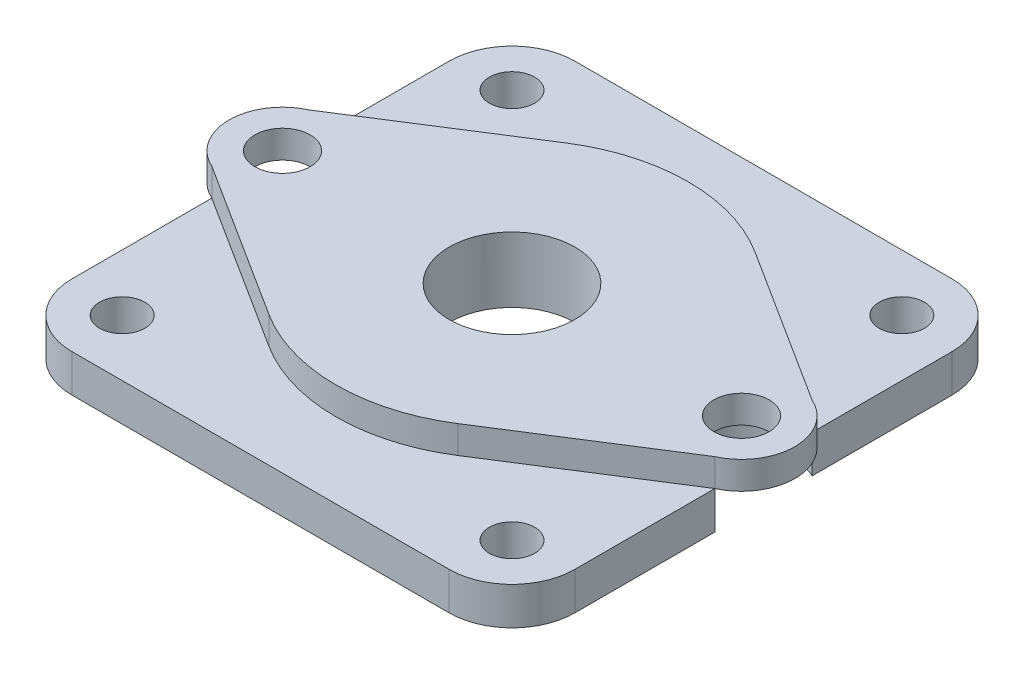
ISO-10303-21;
HEADER;
FILE_DESCRIPTION(('STEP AP214'),'2;1');
FILE_NAME('part.step','',(''),(''),'','','');
FILE_SCHEMA(('AUTOMOTIVE_DESIGN { 1 0 10303 214 1 1 1 1 }'));
ENDSEC;
DATA;
#1=APPLICATION_CONTEXT('core data for automotive mechanical design processes');
#2=APPLICATION_PROTOCOL_DEFINITION('international standard','automotive_design',2000,#1);
#3=PRODUCT_CONTEXT('',#1,'mechanical');
#4=PRODUCT('Part','Part','',(#3));
#5=PRODUCT_RELATED_PRODUCT_CATEGORY('part','',(#4));
#6=PRODUCT_DEFINITION_FORMATION('','',#4);
#7=PRODUCT_DEFINITION_CONTEXT('part definition',#1,'design');
#8=PRODUCT_DEFINITION('design','',#6,#7);
#9=PRODUCT_DEFINITION_SHAPE('','',#8);
#10=(LENGTH_UNIT() NAMED_UNIT(*) SI_UNIT(.MILLI.,.METRE.));
#11=(NAMED_UNIT(*) PLANE_ANGLE_UNIT() SI_UNIT($,.RADIAN.));
#12=(NAMED_UNIT(*) SI_UNIT($,.STERADIAN.) SOLID_ANGLE_UNIT());
#13=UNCERTAINTY_MEASURE_WITH_UNIT(LENGTH_MEASURE(1.E-05),#10,'distance_accuracy_value','');
#14=(GEOMETRIC_REPRESENTATION_CONTEXT(3) GLOBAL_UNCERTAINTY_ASSIGNED_CONTEXT((#13)) GLOBAL_UNIT_ASSIGNED_CONTEXT((#10,
#11,#12)) REPRESENTATION_CONTEXT('',''));
#15=CARTESIAN_POINT('',(0.,0.,0.));
#16=DIRECTION('',(0.,0.,1.));
#17=DIRECTION('',(1.,0.,0.));
#18=AXIS2_PLACEMENT_3D('',#15,#16,#17);
#19=CARTESIAN_POINT('',(-15.,3.,-15.));
#20=DIRECTION('',(0.,-1.,0.));
#21=DIRECTION('',(0.,0.,-1.));
#22=AXIS2_PLACEMENT_3D('',#19,#20,#21);
#23=PLANE('',#22);
#24=CARTESIAN_POINT('',(15.5,3.,15.5));
#25=DIRECTION('',(0.,1.,0.));
#26=DIRECTION('',(0.,0.,1.));
#27=AXIS2_PLACEMENT_3D('',#24,#25,#26);
#28=CIRCLE('',#27,1.79999999999999);
#29=CARTESIAN_POINT('',(15.5,3.,17.3));
#30=VERTEX_POINT('',#29);
#31=EDGE_CURVE('E272',#30,#30,#28,.T.);
#32=ORIENTED_EDGE('',*,*,#31,.F.);
#33=EDGE_LOOP('',(#32));
#34=FACE_BOUND('',#33,.T.);
#35=CARTESIAN_POINT('',(-15.5,3.,15.5));
#36=DIRECTION('',(0.,1.,0.));
#37=DIRECTION('',(0.,0.,1.));
#38=AXIS2_PLACEMENT_3D('',#35,#36,#37);
#39=CIRCLE('',#38,1.79999999999999);
#40=CARTESIAN_POINT('',(-15.5,3.,17.3));
#41=VERTEX_POINT('',#40);
#42=EDGE_CURVE('E278',#41,#41,#39,.T.);
#43=ORIENTED_EDGE('',*,*,#42,.F.);
#44=EDGE_LOOP('',(#43));
#45=FACE_BOUND('',#44,.T.);
#46=DIRECTION('',(0.843842743580431,0.,-0.536590555364751));
#47=VECTOR('',#46,1.);
#48=CARTESIAN_POINT('',(20.,3.,3.87298334620742));
#49=LINE('',#48,#47);
#50=CARTESIAN_POINT('',(7.51226777510651,3.,11.813798410126));
#51=VERTEX_POINT('',#50);
#52=CARTESIAN_POINT('',(20.,3.,3.87298334620742));
#53=VERTEX_POINT('',#52);
#54=EDGE_CURVE('E50',#51,#53,#49,.T.);
#55=ORIENTED_EDGE('',*,*,#54,.F.);
#56=CARTESIAN_POINT('',(0.,3.,0.));
#57=DIRECTION('',(0.,1.,0.));
#58=DIRECTION('',(0.,0.,1.));
#59=AXIS2_PLACEMENT_3D('',#56,#57,#58);
#60=CIRCLE('',#59,14.);
#61=CARTESIAN_POINT('',(-7.51226777510651,3.,11.813798410126));
#62=VERTEX_POINT('',#61);
#63=EDGE_CURVE('E54',#62,#51,#60,.T.);
#64=ORIENTED_EDGE('',*,*,#63,.F.);
#65=DIRECTION('',(0.843842743580431,0.,0.536590555364751));
#66=VECTOR('',#65,1.);
#67=CARTESIAN_POINT('',(-20.,3.,3.87298334620742));
#68=LINE('',#67,#66);
#69=CARTESIAN_POINT('',(-20.,3.,3.87298334620742));
#70=VERTEX_POINT('',#69);
#71=EDGE_CURVE('E162',#70,#62,#68,.T.);
#72=ORIENTED_EDGE('',*,*,#71,.F.);
#73=DIRECTION('',(0.,0.,1.));
#74=VECTOR('',#73,1.);
#75=CARTESIAN_POINT('',(-20.,3.,3.87298334620742));
#76=LINE('',#75,#74);
#77=CARTESIAN_POINT('',(-20.,3.,15.));
#78=VERTEX_POINT('',#77);
#79=EDGE_CURVE('E184',#70,#78,#76,.T.);
#80=ORIENTED_EDGE('',*,*,#79,.T.);
#81=CARTESIAN_POINT('',(-15.,3.,15.));
#82=DIRECTION('',(0.,1.,0.));
#83=DIRECTION('',(0.,0.,1.));
#84=AXIS2_PLACEMENT_3D('',#81,#82,#83);
#85=CIRCLE('',#84,5.);
#86=CARTESIAN_POINT('',(-15.,3.,20.));
#87=VERTEX_POINT('',#86);
#88=EDGE_CURVE('E196',#78,#87,#85,.T.);
#89=ORIENTED_EDGE('',*,*,#88,.T.);
#90=DIRECTION('',(1.,0.,0.));
#91=VECTOR('',#90,1.);
#92=CARTESIAN_POINT('',(-15.,3.,20.));
#93=LINE('',#92,#91);
#94=CARTESIAN_POINT('',(15.,3.,20.));
#95=VERTEX_POINT('',#94);
#96=EDGE_CURVE('E302',#87,#95,#93,.T.);
#97=ORIENTED_EDGE('',*,*,#96,.T.);
#98=CARTESIAN_POINT('',(15.,3.,15.));
#99=DIRECTION('',(0.,1.,0.));
#100=DIRECTION('',(0.,0.,1.));
#101=AXIS2_PLACEMENT_3D('',#98,#99,#100);
#102=CIRCLE('',#101,5.);
#103=CARTESIAN_POINT('',(20.,3.,15.));
#104=VERTEX_POINT('',#103);
#105=EDGE_CURVE('E304',#95,#104,#102,.T.);
#106=ORIENTED_EDGE('',*,*,#105,.T.);
#107=DIRECTION('',(0.,0.,-1.));
#108=VECTOR('',#107,1.);
#109=CARTESIAN_POINT('',(20.,3.,3.87298334620742));
#110=LINE('',#109,#108);
#111=EDGE_CURVE('E306',#104,#53,#110,.T.);
#112=ORIENTED_EDGE('',*,*,#111,.T.);
#113=EDGE_LOOP('',(#55,#64,#72,#80,#89,#97,#106,#112));
#114=FACE_BOUND('',#113,.T.);
#115=ADVANCED_FACE('F35',(#34,#45,#114),#23,.F.);
#116=CARTESIAN_POINT('',(15.5,3.,-15.5));
#117=DIRECTION('',(0.,1.,0.));
#118=DIRECTION('',(0.,0.,1.));
#119=AXIS2_PLACEMENT_3D('',#116,#117,#118);
#120=CIRCLE('',#119,1.8);
#121=CARTESIAN_POINT('',(15.5,3.,-13.7));
#122=VERTEX_POINT('',#121);
#123=EDGE_CURVE('E284',#122,#122,#120,.T.);
#124=ORIENTED_EDGE('',*,*,#123,.F.);
#125=EDGE_LOOP('',(#124));
#126=FACE_BOUND('',#125,.T.);
#127=CARTESIAN_POINT('',(-15.5,3.,-15.5));
#128=DIRECTION('',(0.,1.,0.));
#129=DIRECTION('',(0.,0.,1.));
#130=AXIS2_PLACEMENT_3D('',#127,#128,#129);
#131=CIRCLE('',#130,1.8);
#132=CARTESIAN_POINT('',(-15.5,3.,-13.7));
#133=VERTEX_POINT('',#132);
#134=EDGE_CURVE('E290',#133,#133,#131,.T.);
#135=ORIENTED_EDGE('',*,*,#134,.F.);
#136=EDGE_LOOP('',(#135));
#137=FACE_BOUND('',#136,.T.);
#138=DIRECTION('',(-0.843842743580431,0.,0.536590555364751));
#139=VECTOR('',#138,1.);
#140=CARTESIAN_POINT('',(-20.,3.,-3.87298334620742));
#141=LINE('',#140,#139);
#142=CARTESIAN_POINT('',(-7.51226777510651,3.,-11.813798410126));
#143=VERTEX_POINT('',#142);
#144=CARTESIAN_POINT('',(-20.,3.,-3.87298334620742));
#145=VERTEX_POINT('',#144);
#146=EDGE_CURVE('E247',#143,#145,#141,.T.);
#147=ORIENTED_EDGE('',*,*,#146,.F.);
#148=CARTESIAN_POINT('',(0.,3.,0.));
#149=DIRECTION('',(0.,1.,0.));
#150=DIRECTION('',(0.,0.,1.));
#151=AXIS2_PLACEMENT_3D('',#148,#149,#150);
#152=CIRCLE('',#151,14.);
#153=CARTESIAN_POINT('',(7.51226777510651,3.,-11.813798410126));
#154=VERTEX_POINT('',#153);
#155=EDGE_CURVE('E244',#154,#143,#152,.T.);
#156=ORIENTED_EDGE('',*,*,#155,.F.);
#157=DIRECTION('',(-0.843842743580431,0.,-0.536590555364751));
#158=VECTOR('',#157,1.);
#159=CARTESIAN_POINT('',(20.,3.,-3.87298334620742));
#160=LINE('',#159,#158);
#161=CARTESIAN_POINT('',(20.,3.,-3.87298334620742));
#162=VERTEX_POINT('',#161);
#163=EDGE_CURVE('E241',#162,#154,#160,.T.);
#164=ORIENTED_EDGE('',*,*,#163,.F.);
#165=DIRECTION('',(0.,0.,-1.));
#166=VECTOR('',#165,1.);
#167=CARTESIAN_POINT('',(20.,3.,-15.));
#168=LINE('',#167,#166);
#169=CARTESIAN_POINT('',(20.,3.,-15.));
#170=VERTEX_POINT('',#169);
#171=EDGE_CURVE('E311',#162,#170,#168,.T.);
#172=ORIENTED_EDGE('',*,*,#171,.T.);
#173=CARTESIAN_POINT('',(15.,3.,-15.));
#174=DIRECTION('',(0.,1.,0.));
#175=DIRECTION('',(0.,0.,1.));
#176=AXIS2_PLACEMENT_3D('',#173,#174,#175);
#177=CIRCLE('',#176,5.);
#178=CARTESIAN_POINT('',(15.,3.,-20.));
#179=VERTEX_POINT('',#178);
#180=EDGE_CURVE('E313',#170,#179,#177,.T.);
#181=ORIENTED_EDGE('',*,*,#180,.T.);
#182=DIRECTION('',(-1.,0.,0.));
#183=VECTOR('',#182,1.);
#184=CARTESIAN_POINT('',(-15.,3.,-20.));
#185=LINE('',#184,#183);
#186=CARTESIAN_POINT('',(-15.,3.,-20.));
#187=VERTEX_POINT('',#186);
#188=EDGE_CURVE('E315',#179,#187,#185,.T.);
#189=ORIENTED_EDGE('',*,*,#188,.T.);
#190=CARTESIAN_POINT('',(-15.,3.,-15.));
#191=DIRECTION('',(0.,1.,0.));
#192=DIRECTION('',(0.,0.,-1.));
#193=AXIS2_PLACEMENT_3D('',#190,#191,#192);
#194=CIRCLE('',#193,5.);
#195=CARTESIAN_POINT('',(-20.,3.,-15.));
#196=VERTEX_POINT('',#195);
#197=EDGE_CURVE('E296',#187,#196,#194,.T.);
#198=ORIENTED_EDGE('',*,*,#197,.T.);
#199=DIRECTION('',(0.,0.,1.));
#200=VECTOR('',#199,1.);
#201=CARTESIAN_POINT('',(-20.,3.,-15.));
#202=LINE('',#201,#200);
#203=EDGE_CURVE('E185',#196,#145,#202,.T.);
#204=ORIENTED_EDGE('',*,*,#203,.T.);
#205=EDGE_LOOP('',(#147,#156,#164,#172,#181,#189,#198,#204));
#206=FACE_BOUND('',#205,.T.);
#207=ADVANCED_FACE('F444',(#126,#137,#206),#23,.F.);
#208=CARTESIAN_POINT('',(-15.,0.,-15.));
#209=DIRECTION('',(0.,-1.,0.));
#210=DIRECTION('',(0.,0.,-1.));
#211=AXIS2_PLACEMENT_3D('',#208,#209,#210);
#212=PLANE('',#211);
#213=CARTESIAN_POINT('',(15.5,0.,15.5));
#214=DIRECTION('',(0.,1.,0.));
#215=DIRECTION('',(0.,0.,1.));
#216=AXIS2_PLACEMENT_3D('',#213,#214,#215);
#217=CIRCLE('',#216,1.79999999999999);
#218=CARTESIAN_POINT('',(15.5,0.,17.3));
#219=VERTEX_POINT('',#218);
#220=EDGE_CURVE('E271',#219,#219,#217,.T.);
#221=ORIENTED_EDGE('',*,*,#220,.T.);
#222=EDGE_LOOP('',(#221));
#223=FACE_BOUND('',#222,.T.);
#224=CARTESIAN_POINT('',(15.5,0.,-15.5));
#225=DIRECTION('',(0.,1.,0.));
#226=DIRECTION('',(0.,0.,1.));
#227=AXIS2_PLACEMENT_3D('',#224,#225,#226);
#228=CIRCLE('',#227,1.8);
#229=CARTESIAN_POINT('',(15.5,0.,-13.7));
#230=VERTEX_POINT('',#229);
#231=EDGE_CURVE('E281',#230,#230,#228,.T.);
#232=ORIENTED_EDGE('',*,*,#231,.T.);
#233=EDGE_LOOP('',(#232));
#234=FACE_BOUND('',#233,.T.);
#235=CARTESIAN_POINT('',(-15.,0.,-15.));
#236=DIRECTION('',(0.,1.,0.));
#237=DIRECTION('',(0.,0.,-1.));
#238=AXIS2_PLACEMENT_3D('',#235,#236,#237);
#239=CIRCLE('',#238,5.);
#240=CARTESIAN_POINT('',(-15.,0.,-20.));
#241=VERTEX_POINT('',#240);
#242=CARTESIAN_POINT('',(-20.,0.,-15.));
#243=VERTEX_POINT('',#242);
#244=EDGE_CURVE('E293',#241,#243,#239,.T.);
#245=ORIENTED_EDGE('',*,*,#244,.F.);
#246=DIRECTION('',(-1.,0.,0.));
#247=VECTOR('',#246,1.);
#248=CARTESIAN_POINT('',(-15.,0.,-20.));
#249=LINE('',#248,#247);
#250=CARTESIAN_POINT('',(15.,0.,-20.));
#251=VERTEX_POINT('',#250);
#252=EDGE_CURVE('E299',#251,#241,#249,.T.);
#253=ORIENTED_EDGE('',*,*,#252,.F.);
#254=CARTESIAN_POINT('',(15.,0.,-15.));
#255=DIRECTION('',(0.,1.,0.));
#256=DIRECTION('',(0.,0.,1.));
#257=AXIS2_PLACEMENT_3D('',#254,#255,#256);
#258=CIRCLE('',#257,5.);
#259=CARTESIAN_POINT('',(20.,0.,-15.));
#260=VERTEX_POINT('',#259);
#261=EDGE_CURVE('E337',#260,#251,#258,.T.);
#262=ORIENTED_EDGE('',*,*,#261,.F.);
#263=DIRECTION('',(0.,0.,-1.));
#264=VECTOR('',#263,1.);
#265=CARTESIAN_POINT('',(20.,0.,-15.));
#266=LINE('',#265,#264);
#267=CARTESIAN_POINT('',(20.,0.,-3.87298334620742));
#268=VERTEX_POINT('',#267);
#269=EDGE_CURVE('E335',#268,#260,#266,.T.);
#270=ORIENTED_EDGE('',*,*,#269,.F.);
#271=CARTESIAN_POINT('',(18.25,0.,0.));
#272=DIRECTION('',(0.,-1.,0.));
#273=DIRECTION('',(0.,0.,1.));
#274=AXIS2_PLACEMENT_3D('',#271,#272,#273);
#275=CIRCLE('',#274,4.25);
#276=CARTESIAN_POINT('',(20.,0.,3.87298334620742));
#277=VERTEX_POINT('',#276);
#278=EDGE_CURVE('E333',#277,#268,#275,.T.);
#279=ORIENTED_EDGE('',*,*,#278,.F.);
#280=DIRECTION('',(0.,0.,-1.));
#281=VECTOR('',#280,1.);
#282=CARTESIAN_POINT('',(20.,0.,3.87298334620742));
#283=LINE('',#282,#281);
#284=CARTESIAN_POINT('',(20.,0.,15.));
#285=VERTEX_POINT('',#284);
#286=EDGE_CURVE('E331',#285,#277,#283,.T.);
#287=ORIENTED_EDGE('',*,*,#286,.F.);
#288=CARTESIAN_POINT('',(15.,0.,15.));
#289=DIRECTION('',(0.,1.,0.));
#290=DIRECTION('',(0.,0.,1.));
#291=AXIS2_PLACEMENT_3D('',#288,#289,#290);
#292=CIRCLE('',#291,5.);
#293=CARTESIAN_POINT('',(15.,0.,20.));
#294=VERTEX_POINT('',#293);
#295=EDGE_CURVE('E329',#294,#285,#292,.T.);
#296=ORIENTED_EDGE('',*,*,#295,.F.);
#297=DIRECTION('',(1.,0.,0.));
#298=VECTOR('',#297,1.);
#299=CARTESIAN_POINT('',(-15.,0.,20.));
#300=LINE('',#299,#298);
#301=CARTESIAN_POINT('',(-15.,0.,20.));
#302=VERTEX_POINT('',#301);
#303=EDGE_CURVE('E327',#302,#294,#300,.T.);
#304=ORIENTED_EDGE('',*,*,#303,.F.);
#305=CARTESIAN_POINT('',(-15.,0.,15.));
#306=DIRECTION('',(0.,1.,0.));
#307=DIRECTION('',(0.,0.,1.));
#308=AXIS2_PLACEMENT_3D('',#305,#306,#307);
#309=CIRCLE('',#308,5.);
#310=CARTESIAN_POINT('',(-20.,0.,15.));
#311=VERTEX_POINT('',#310);
#312=EDGE_CURVE('E325',#311,#302,#309,.T.);
#313=ORIENTED_EDGE('',*,*,#312,.F.);
#314=DIRECTION('',(0.,0.,1.));
#315=VECTOR('',#314,1.);
#316=CARTESIAN_POINT('',(-20.,0.,3.87298334620742));
#317=LINE('',#316,#315);
#318=CARTESIAN_POINT('',(-20.,0.,3.87298334620742));
#319=VERTEX_POINT('',#318);
#320=EDGE_CURVE('E323',#319,#311,#317,.T.);
#321=ORIENTED_EDGE('',*,*,#320,.F.);
#322=CARTESIAN_POINT('',(-18.25,0.,0.));
#323=DIRECTION('',(0.,-1.,0.));
#324=DIRECTION('',(0.,0.,1.));
#325=AXIS2_PLACEMENT_3D('',#322,#323,#324);
#326=CIRCLE('',#325,4.25);
#327=CARTESIAN_POINT('',(-20.,0.,-3.87298334620742));
#328=VERTEX_POINT('',#327);
#329=EDGE_CURVE('E200',#328,#319,#326,.T.);
#330=ORIENTED_EDGE('',*,*,#329,.F.);
#331=DIRECTION('',(0.,0.,1.));
#332=VECTOR('',#331,1.);
#333=CARTESIAN_POINT('',(-20.,0.,-15.));
#334=LINE('',#333,#332);
#335=EDGE_CURVE('E320',#243,#328,#334,.T.);
#336=ORIENTED_EDGE('',*,*,#335,.F.);
#337=EDGE_LOOP('',(#245,#253,#262,#270,#279,#287,#296,#304,#313,#321,#330,#336));
#338=FACE_BOUND('',#337,.T.);
#339=CARTESIAN_POINT('',(-15.5,0.,-15.5));
#340=DIRECTION('',(0.,1.,0.));
#341=DIRECTION('',(0.,0.,1.));
#342=AXIS2_PLACEMENT_3D('',#339,#340,#341);
#343=CIRCLE('',#342,1.8);
#344=CARTESIAN_POINT('',(-15.5,0.,-13.7));
#345=VERTEX_POINT('',#344);
#346=EDGE_CURVE('E287',#345,#345,#343,.T.);
#347=ORIENTED_EDGE('',*,*,#346,.T.);
#348=EDGE_LOOP('',(#347));
#349=FACE_BOUND('',#348,.T.);
#350=CARTESIAN_POINT('',(-15.5,0.,15.5));
#351=DIRECTION('',(0.,1.,0.));
#352=DIRECTION('',(0.,0.,1.));
#353=AXIS2_PLACEMENT_3D('',#350,#351,#352);
#354=CIRCLE('',#353,1.79999999999999);
#355=CARTESIAN_POINT('',(-15.5,0.,17.3));
#356=VERTEX_POINT('',#355);
#357=EDGE_CURVE('E275',#356,#356,#354,.T.);
#358=ORIENTED_EDGE('',*,*,#357,.T.);
#359=EDGE_LOOP('',(#358));
#360=FACE_BOUND('',#359,.T.);
#361=CARTESIAN_POINT('',(0.,0.,0.));
#362=DIRECTION('',(0.,1.,0.));
#363=DIRECTION('',(0.,0.,1.));
#364=AXIS2_PLACEMENT_3D('',#361,#362,#363);
#365=CIRCLE('',#364,5.);
#366=CARTESIAN_POINT('',(0.,0.,5.));
#367=VERTEX_POINT('',#366);
#368=EDGE_CURVE('E268',#367,#367,#365,.T.);
#369=ORIENTED_EDGE('',*,*,#368,.T.);
#370=EDGE_LOOP('',(#369));
#371=FACE_BOUND('',#370,.T.);
#372=ADVANCED_FACE('F367',(#223,#234,#338,#349,#360,#371),#212,.T.);
#373=CARTESIAN_POINT('',(-15.,3.,-15.));
#374=DIRECTION('',(0.,-1.,0.));
#375=DIRECTION('',(0.,0.,-1.));
#376=AXIS2_PLACEMENT_3D('',#373,#374,#375);
#377=CYLINDRICAL_SURFACE('',#376,5.);
#378=ORIENTED_EDGE('',*,*,#244,.T.);
#379=DIRECTION('',(0.,-1.,0.));
#380=VECTOR('',#379,1.);
#381=CARTESIAN_POINT('',(-20.,3.,-15.));
#382=LINE('',#381,#380);
#383=EDGE_CURVE('E11',#196,#243,#382,.T.);
#384=ORIENTED_EDGE('',*,*,#383,.F.);
#385=ORIENTED_EDGE('',*,*,#197,.F.);
#386=DIRECTION('',(0.,-1.,0.));
#387=VECTOR('',#386,1.);
#388=CARTESIAN_POINT('',(-15.,3.,-20.));
#389=LINE('',#388,#387);
#390=EDGE_CURVE('E317',#187,#241,#389,.T.);
#391=ORIENTED_EDGE('',*,*,#390,.T.);
#392=EDGE_LOOP('',(#378,#384,#385,#391));
#393=FACE_BOUND('',#392,.T.);
#394=ADVANCED_FACE('F37',(#393),#377,.T.);
#395=CARTESIAN_POINT('',(-20.,3.,-15.));
#396=DIRECTION('',(1.,0.,0.));
#397=DIRECTION('',(0.,0.,-1.));
#398=AXIS2_PLACEMENT_3D('',#395,#396,#397);
#399=PLANE('',#398);
#400=ORIENTED_EDGE('',*,*,#335,.T.);
#401=DIRECTION('',(0.,-1.,0.));
#402=VECTOR('',#401,1.);
#403=CARTESIAN_POINT('',(-20.,3.,-3.87298334620742));
#404=LINE('',#403,#402);
#405=EDGE_CURVE('E43',#145,#328,#404,.T.);
#406=ORIENTED_EDGE('',*,*,#405,.F.);
#407=ORIENTED_EDGE('',*,*,#203,.F.);
#408=ORIENTED_EDGE('',*,*,#383,.T.);
#409=EDGE_LOOP('',(#400,#406,#407,#408));
#410=FACE_BOUND('',#409,.T.);
#411=ADVANCED_FACE('F485',(#410),#399,.F.);
#412=CARTESIAN_POINT('',(-18.25,3.,0.));
#413=DIRECTION('',(0.,-1.,0.));
#414=DIRECTION('',(0.,0.,-1.));
#415=AXIS2_PLACEMENT_3D('',#412,#413,#414);
#416=CYLINDRICAL_SURFACE('',#415,4.25);
#417=ORIENTED_EDGE('',*,*,#329,.T.);
#418=DIRECTION('',(0.,-1.,0.));
#419=VECTOR('',#418,1.);
#420=CARTESIAN_POINT('',(-20.,3.,3.87298334620742));
#421=LINE('',#420,#419);
#422=EDGE_CURVE('E191',#70,#319,#421,.T.);
#423=ORIENTED_EDGE('',*,*,#422,.F.);
#424=CARTESIAN_POINT('',(-18.25,3.,0.));
#425=DIRECTION('',(0.,-1.,0.));
#426=DIRECTION('',(0.,0.,1.));
#427=AXIS2_PLACEMENT_3D('',#424,#425,#426);
#428=CIRCLE('',#427,4.25);
#429=EDGE_CURVE('E175',#145,#70,#428,.T.);
#430=ORIENTED_EDGE('',*,*,#429,.F.);
#431=ORIENTED_EDGE('',*,*,#405,.T.);
#432=EDGE_LOOP('',(#417,#423,#430,#431));
#433=FACE_BOUND('',#432,.T.);
#434=ADVANCED_FACE('F198',(#433),#416,.F.);
#435=CARTESIAN_POINT('',(-20.,3.,3.87298334620742));
#436=DIRECTION('',(1.,0.,0.));
#437=DIRECTION('',(0.,0.,-1.));
#438=AXIS2_PLACEMENT_3D('',#435,#436,#437);
#439=PLANE('',#438);
#440=ORIENTED_EDGE('',*,*,#320,.T.);
#441=DIRECTION('',(0.,-1.,0.));
#442=VECTOR('',#441,1.);
#443=CARTESIAN_POINT('',(-20.,3.,15.));
#444=LINE('',#443,#442);
#445=EDGE_CURVE('E194',#78,#311,#444,.T.);
#446=ORIENTED_EDGE('',*,*,#445,.F.);
#447=ORIENTED_EDGE('',*,*,#79,.F.);
#448=ORIENTED_EDGE('',*,*,#422,.T.);
#449=EDGE_LOOP('',(#440,#446,#447,#448));
#450=FACE_BOUND('',#449,.T.);
#451=ADVANCED_FACE('F190',(#450),#439,.F.);
#452=CARTESIAN_POINT('',(-15.,3.,15.));
#453=DIRECTION('',(0.,-1.,0.));
#454=DIRECTION('',(0.,0.,-1.));
#455=AXIS2_PLACEMENT_3D('',#452,#453,#454);
#456=CYLINDRICAL_SURFACE('',#455,5.);
#457=ORIENTED_EDGE('',*,*,#312,.T.);
#458=DIRECTION('',(0.,-1.,0.));
#459=VECTOR('',#458,1.);
#460=CARTESIAN_POINT('',(-15.,3.,20.));
#461=LINE('',#460,#459);
#462=EDGE_CURVE('E360',#87,#302,#461,.T.);
#463=ORIENTED_EDGE('',*,*,#462,.F.);
#464=ORIENTED_EDGE('',*,*,#88,.F.);
#465=ORIENTED_EDGE('',*,*,#445,.T.);
#466=EDGE_LOOP('',(#457,#463,#464,#465));
#467=FACE_BOUND('',#466,.T.);
#468=ADVANCED_FACE('F372',(#467),#456,.T.);
#469=CARTESIAN_POINT('',(-15.,3.,20.));
#470=DIRECTION('',(0.,0.,-1.));
#471=DIRECTION('',(-1.,0.,0.));
#472=AXIS2_PLACEMENT_3D('',#469,#470,#471);
#473=PLANE('',#472);
#474=ORIENTED_EDGE('',*,*,#303,.T.);
#475=DIRECTION('',(0.,-1.,0.));
#476=VECTOR('',#475,1.);
#477=CARTESIAN_POINT('',(15.,3.,20.));
#478=LINE('',#477,#476);
#479=EDGE_CURVE('E357',#95,#294,#478,.T.);
#480=ORIENTED_EDGE('',*,*,#479,.F.);
#481=ORIENTED_EDGE('',*,*,#96,.F.);
#482=ORIENTED_EDGE('',*,*,#462,.T.);
#483=EDGE_LOOP('',(#474,#480,#481,#482));
#484=FACE_BOUND('',#483,.T.);
#485=ADVANCED_FACE('F379',(#484),#473,.F.);
#486=CARTESIAN_POINT('',(15.,3.,15.));
#487=DIRECTION('',(0.,-1.,0.));
#488=DIRECTION('',(0.,0.,-1.));
#489=AXIS2_PLACEMENT_3D('',#486,#487,#488);
#490=CYLINDRICAL_SURFACE('',#489,5.);
#491=ORIENTED_EDGE('',*,*,#295,.T.);
#492=DIRECTION('',(0.,-1.,0.));
#493=VECTOR('',#492,1.);
#494=CARTESIAN_POINT('',(20.,3.,15.));
#495=LINE('',#494,#493);
#496=EDGE_CURVE('E354',#104,#285,#495,.T.);
#497=ORIENTED_EDGE('',*,*,#496,.F.);
#498=ORIENTED_EDGE('',*,*,#105,.F.);
#499=ORIENTED_EDGE('',*,*,#479,.T.);
#500=EDGE_LOOP('',(#491,#497,#498,#499));
#501=FACE_BOUND('',#500,.T.);
#502=ADVANCED_FACE('F382',(#501),#490,.T.);
#503=CARTESIAN_POINT('',(20.,3.,3.87298334620742));
#504=DIRECTION('',(-1.,0.,0.));
#505=DIRECTION('',(0.,0.,1.));
#506=AXIS2_PLACEMENT_3D('',#503,#504,#505);
#507=PLANE('',#506);
#508=ORIENTED_EDGE('',*,*,#286,.T.);
#509=DIRECTION('',(0.,-1.,0.));
#510=VECTOR('',#509,1.);
#511=CARTESIAN_POINT('',(20.,3.,3.87298334620742));
#512=LINE('',#511,#510);
#513=EDGE_CURVE('E351',#53,#277,#512,.T.);
#514=ORIENTED_EDGE('',*,*,#513,.F.);
#515=ORIENTED_EDGE('',*,*,#111,.F.);
#516=ORIENTED_EDGE('',*,*,#496,.T.);
#517=EDGE_LOOP('',(#508,#514,#515,#516));
#518=FACE_BOUND('',#517,.T.);
#519=ADVANCED_FACE('F387',(#518),#507,.F.);
#520=CARTESIAN_POINT('',(18.25,3.,0.));
#521=DIRECTION('',(0.,-1.,0.));
#522=DIRECTION('',(0.,0.,-1.));
#523=AXIS2_PLACEMENT_3D('',#520,#521,#522);
#524=CYLINDRICAL_SURFACE('',#523,4.25);
#525=ORIENTED_EDGE('',*,*,#278,.T.);
#526=DIRECTION('',(0.,-1.,0.));
#527=VECTOR('',#526,1.);
#528=CARTESIAN_POINT('',(20.,3.,-3.87298334620742));
#529=LINE('',#528,#527);
#530=EDGE_CURVE('E348',#162,#268,#529,.T.);
#531=ORIENTED_EDGE('',*,*,#530,.F.);
#532=CARTESIAN_POINT('',(18.25,3.,0.));
#533=DIRECTION('',(0.,-1.,0.));
#534=DIRECTION('',(0.,0.,1.));
#535=AXIS2_PLACEMENT_3D('',#532,#533,#534);
#536=CIRCLE('',#535,4.25);
#537=EDGE_CURVE('E308',#53,#162,#536,.T.);
#538=ORIENTED_EDGE('',*,*,#537,.F.);
#539=ORIENTED_EDGE('',*,*,#513,.T.);
#540=EDGE_LOOP('',(#525,#531,#538,#539));
#541=FACE_BOUND('',#540,.T.);
#542=ADVANCED_FACE('F392',(#541),#524,.F.);
#543=CARTESIAN_POINT('',(20.,3.,-15.));
#544=DIRECTION('',(-1.,0.,0.));
#545=DIRECTION('',(0.,0.,1.));
#546=AXIS2_PLACEMENT_3D('',#543,#544,#545);
#547=PLANE('',#546);
#548=ORIENTED_EDGE('',*,*,#269,.T.);
#549=DIRECTION('',(0.,-1.,0.));
#550=VECTOR('',#549,1.);
#551=CARTESIAN_POINT('',(20.,3.,-15.));
#552=LINE('',#551,#550);
#553=EDGE_CURVE('E345',#170,#260,#552,.T.);
#554=ORIENTED_EDGE('',*,*,#553,.F.);
#555=ORIENTED_EDGE('',*,*,#171,.F.);
#556=ORIENTED_EDGE('',*,*,#530,.T.);
#557=EDGE_LOOP('',(#548,#554,#555,#556));
#558=FACE_BOUND('',#557,.T.);
#559=ADVANCED_FACE('F467',(#558),#547,.F.);
#560=CARTESIAN_POINT('',(15.,3.,-15.));
#561=DIRECTION('',(0.,-1.,0.));
#562=DIRECTION('',(0.,0.,-1.));
#563=AXIS2_PLACEMENT_3D('',#560,#561,#562);
#564=CYLINDRICAL_SURFACE('',#563,5.);
#565=ORIENTED_EDGE('',*,*,#261,.T.);
#566=DIRECTION('',(0.,-1.,0.));
#567=VECTOR('',#566,1.);
#568=CARTESIAN_POINT('',(15.,3.,-20.));
#569=LINE('',#568,#567);
#570=EDGE_CURVE('E342',#179,#251,#569,.T.);
#571=ORIENTED_EDGE('',*,*,#570,.F.);
#572=ORIENTED_EDGE('',*,*,#180,.F.);
#573=ORIENTED_EDGE('',*,*,#553,.T.);
#574=EDGE_LOOP('',(#565,#571,#572,#573));
#575=FACE_BOUND('',#574,.T.);
#576=ADVANCED_FACE('F463',(#575),#564,.T.);
#577=CARTESIAN_POINT('',(-15.,3.,-20.));
#578=DIRECTION('',(0.,0.,1.));
#579=DIRECTION('',(1.,0.,0.));
#580=AXIS2_PLACEMENT_3D('',#577,#578,#579);
#581=PLANE('',#580);
#582=ORIENTED_EDGE('',*,*,#252,.T.);
#583=ORIENTED_EDGE('',*,*,#390,.F.);
#584=ORIENTED_EDGE('',*,*,#188,.F.);
#585=ORIENTED_EDGE('',*,*,#570,.T.);
#586=EDGE_LOOP('',(#582,#583,#584,#585));
#587=FACE_BOUND('',#586,.T.);
#588=ADVANCED_FACE('F460',(#587),#581,.F.);
#589=CARTESIAN_POINT('',(-15.5,3.,-15.5));
#590=DIRECTION('',(0.,-1.,0.));
#591=DIRECTION('',(0.,0.,-1.));
#592=AXIS2_PLACEMENT_3D('',#589,#590,#591);
#593=CYLINDRICAL_SURFACE('',#592,1.8);
#594=ORIENTED_EDGE('',*,*,#134,.T.);
#595=EDGE_LOOP('',(#594));
#596=FACE_BOUND('',#595,.T.);
#597=ORIENTED_EDGE('',*,*,#346,.F.);
#598=EDGE_LOOP('',(#597));
#599=FACE_BOUND('',#598,.T.);
#600=ADVANCED_FACE('F455',(#596,#599),#593,.F.);
#601=CARTESIAN_POINT('',(15.5,3.,-15.5));
#602=DIRECTION('',(0.,-1.,0.));
#603=DIRECTION('',(0.,0.,-1.));
#604=AXIS2_PLACEMENT_3D('',#601,#602,#603);
#605=CYLINDRICAL_SURFACE('',#604,1.8);
#606=ORIENTED_EDGE('',*,*,#123,.T.);
#607=EDGE_LOOP('',(#606));
#608=FACE_BOUND('',#607,.T.);
#609=ORIENTED_EDGE('',*,*,#231,.F.);
#610=EDGE_LOOP('',(#609));
#611=FACE_BOUND('',#610,.T.);
#612=ADVANCED_FACE('F647',(#608,#611),#605,.F.);
#613=CARTESIAN_POINT('',(-15.5,3.,15.5));
#614=DIRECTION('',(0.,-1.,0.));
#615=DIRECTION('',(0.,0.,-1.));
#616=AXIS2_PLACEMENT_3D('',#613,#614,#615);
#617=CYLINDRICAL_SURFACE('',#616,1.79999999999999);
#618=ORIENTED_EDGE('',*,*,#42,.T.);
#619=EDGE_LOOP('',(#618));
#620=FACE_BOUND('',#619,.T.);
#621=ORIENTED_EDGE('',*,*,#357,.F.);
#622=EDGE_LOOP('',(#621));
#623=FACE_BOUND('',#622,.T.);
#624=ADVANCED_FACE('F656',(#620,#623),#617,.F.);
#625=CARTESIAN_POINT('',(15.5,3.,15.5));
#626=DIRECTION('',(0.,-1.,0.));
#627=DIRECTION('',(0.,0.,-1.));
#628=AXIS2_PLACEMENT_3D('',#625,#626,#627);
#629=CYLINDRICAL_SURFACE('',#628,1.79999999999999);
#630=ORIENTED_EDGE('',*,*,#31,.T.);
#631=EDGE_LOOP('',(#630));
#632=FACE_BOUND('',#631,.T.);
#633=ORIENTED_EDGE('',*,*,#220,.F.);
#634=EDGE_LOOP('',(#633));
#635=FACE_BOUND('',#634,.T.);
#636=ADVANCED_FACE('F665',(#632,#635),#629,.F.);
#637=CARTESIAN_POINT('',(0.,3.,0.));
#638=DIRECTION('',(0.,-1.,0.));
#639=DIRECTION('',(0.,0.,-1.));
#640=AXIS2_PLACEMENT_3D('',#637,#638,#639);
#641=CYLINDRICAL_SURFACE('',#640,5.);
#642=ORIENTED_EDGE('',*,*,#368,.F.);
#643=EDGE_LOOP('',(#642));
#644=FACE_BOUND('',#643,.T.);
#645=CARTESIAN_POINT('',(0.,5.2,0.));
#646=DIRECTION('',(0.,-1.,0.));
#647=DIRECTION('',(0.,0.,-1.));
#648=AXIS2_PLACEMENT_3D('',#645,#646,#647);
#649=CIRCLE('',#648,5.);
#650=CARTESIAN_POINT('',(0.,5.2,-5.));
#651=VERTEX_POINT('',#650);
#652=EDGE_CURVE('E215',#651,#651,#649,.T.);
#653=ORIENTED_EDGE('',*,*,#652,.F.);
#654=EDGE_LOOP('',(#653));
#655=FACE_BOUND('',#654,.T.);
#656=ADVANCED_FACE('F422',(#644,#655),#641,.F.);
#657=CARTESIAN_POINT('',(18.25,5.2,0.));
#658=DIRECTION('',(0.,1.,0.));
#659=DIRECTION('',(0.,0.,1.));
#660=AXIS2_PLACEMENT_3D('',#657,#658,#659);
#661=PLANE('',#660);
#662=CARTESIAN_POINT('',(-18.25,5.2,0.));
#663=DIRECTION('',(0.,-1.,0.));
#664=DIRECTION('',(0.,0.,-1.));
#665=AXIS2_PLACEMENT_3D('',#662,#663,#664);
#666=CIRCLE('',#665,4.25);
#667=CARTESIAN_POINT('',(-20.,5.2,3.87298334620742));
#668=VERTEX_POINT('',#667);
#669=CARTESIAN_POINT('',(-20.,5.2,-3.87298334620742));
#670=VERTEX_POINT('',#669);
#671=EDGE_CURVE('E207',#668,#670,#666,.T.);
#672=ORIENTED_EDGE('',*,*,#671,.F.);
#673=DIRECTION('',(0.843842743580431,0.,0.536590555364751));
#674=VECTOR('',#673,1.);
#675=CARTESIAN_POINT('',(-20.,5.2,3.87298334620742));
#676=LINE('',#675,#674);
#677=CARTESIAN_POINT('',(-7.51226777510651,5.2,11.813798410126));
#678=VERTEX_POINT('',#677);
#679=EDGE_CURVE('E164',#668,#678,#676,.T.);
#680=ORIENTED_EDGE('',*,*,#679,.T.);
#681=CARTESIAN_POINT('',(0.,5.2,0.));
#682=DIRECTION('',(0.,1.,0.));
#683=DIRECTION('',(0.,0.,1.));
#684=AXIS2_PLACEMENT_3D('',#681,#682,#683);
#685=CIRCLE('',#684,14.);
#686=CARTESIAN_POINT('',(7.51226777510651,5.2,11.813798410126));
#687=VERTEX_POINT('',#686);
#688=EDGE_CURVE('E234',#678,#687,#685,.T.);
#689=ORIENTED_EDGE('',*,*,#688,.T.);
#690=DIRECTION('',(0.843842743580431,0.,-0.536590555364751));
#691=VECTOR('',#690,1.);
#692=CARTESIAN_POINT('',(20.,5.2,3.87298334620742));
#693=LINE('',#692,#691);
#694=CARTESIAN_POINT('',(20.,5.2,3.87298334620742));
#695=VERTEX_POINT('',#694);
#696=EDGE_CURVE('E236',#687,#695,#693,.T.);
#697=ORIENTED_EDGE('',*,*,#696,.T.);
#698=CARTESIAN_POINT('',(18.25,5.2,0.));
#699=DIRECTION('',(0.,-1.,0.));
#700=DIRECTION('',(0.,0.,-1.));
#701=AXIS2_PLACEMENT_3D('',#698,#699,#700);
#702=CIRCLE('',#701,4.25);
#703=CARTESIAN_POINT('',(20.,5.2,-3.87298334620742));
#704=VERTEX_POINT('',#703);
#705=EDGE_CURVE('E212',#704,#695,#702,.T.);
#706=ORIENTED_EDGE('',*,*,#705,.F.);
#707=DIRECTION('',(-0.843842743580431,0.,-0.536590555364751));
#708=VECTOR('',#707,1.);
#709=CARTESIAN_POINT('',(20.,5.2,-3.87298334620742));
#710=LINE('',#709,#708);
#711=CARTESIAN_POINT('',(7.51226777510651,5.2,-11.813798410126));
#712=VERTEX_POINT('',#711);
#713=EDGE_CURVE('E224',#704,#712,#710,.T.);
#714=ORIENTED_EDGE('',*,*,#713,.T.);
#715=CARTESIAN_POINT('',(0.,5.2,0.));
#716=DIRECTION('',(0.,1.,0.));
#717=DIRECTION('',(0.,0.,1.));
#718=AXIS2_PLACEMENT_3D('',#715,#716,#717);
#719=CIRCLE('',#718,14.);
#720=CARTESIAN_POINT('',(-7.51226777510651,5.2,-11.813798410126));
#721=VERTEX_POINT('',#720);
#722=EDGE_CURVE('E226',#712,#721,#719,.T.);
#723=ORIENTED_EDGE('',*,*,#722,.T.);
#724=DIRECTION('',(-0.843842743580431,0.,0.536590555364751));
#725=VECTOR('',#724,1.);
#726=CARTESIAN_POINT('',(-20.,5.2,-3.87298334620742));
#727=LINE('',#726,#725);
#728=EDGE_CURVE('E228',#721,#670,#727,.T.);
#729=ORIENTED_EDGE('',*,*,#728,.T.);
#730=EDGE_LOOP('',(#672,#680,#689,#697,#706,#714,#723,#729));
#731=FACE_BOUND('',#730,.T.);
#732=CARTESIAN_POINT('',(18.25,5.2,0.));
#733=DIRECTION('',(0.,-1.,0.));
#734=DIRECTION('',(0.,0.,1.));
#735=AXIS2_PLACEMENT_3D('',#732,#733,#734);
#736=CIRCLE('',#735,2.2);
#737=CARTESIAN_POINT('',(18.25,5.2,2.2));
#738=VERTEX_POINT('',#737);
#739=EDGE_CURVE('E221',#738,#738,#736,.T.);
#740=ORIENTED_EDGE('',*,*,#739,.T.);
#741=EDGE_LOOP('',(#740));
#742=FACE_BOUND('',#741,.T.);
#743=ORIENTED_EDGE('',*,*,#652,.T.);
#744=EDGE_LOOP('',(#743));
#745=FACE_BOUND('',#744,.T.);
#746=CARTESIAN_POINT('',(-18.25,5.2,0.));
#747=DIRECTION('',(0.,-1.,0.));
#748=DIRECTION('',(0.,0.,1.));
#749=AXIS2_PLACEMENT_3D('',#746,#747,#748);
#750=CIRCLE('',#749,2.2);
#751=CARTESIAN_POINT('',(-18.25,5.2,2.2));
#752=VERTEX_POINT('',#751);
#753=EDGE_CURVE('E230',#752,#752,#750,.T.);
#754=ORIENTED_EDGE('',*,*,#753,.T.);
#755=EDGE_LOOP('',(#754));
#756=FACE_BOUND('',#755,.T.);
#757=ADVANCED_FACE('F419',(#731,#742,#745,#756),#661,.T.);
#758=CARTESIAN_POINT('',(20.,5.2,3.87298334620742));
#759=DIRECTION('',(-0.536590555364751,0.,-0.843842743580431));
#760=DIRECTION('',(-0.843842743580431,0.,0.536590555364751));
#761=AXIS2_PLACEMENT_3D('',#758,#759,#760);
#762=PLANE('',#761);
#763=ORIENTED_EDGE('',*,*,#54,.T.);
#764=DIRECTION('',(0.,-1.,0.));
#765=VECTOR('',#764,1.);
#766=CARTESIAN_POINT('',(20.,5.2,3.87298334620742));
#767=LINE('',#766,#765);
#768=EDGE_CURVE('E238',#695,#53,#767,.T.);
#769=ORIENTED_EDGE('',*,*,#768,.F.);
#770=ORIENTED_EDGE('',*,*,#696,.F.);
#771=DIRECTION('',(0.,-1.,0.));
#772=VECTOR('',#771,1.);
#773=CARTESIAN_POINT('',(7.51226777510651,5.2,11.813798410126));
#774=LINE('',#773,#772);
#775=EDGE_CURVE('E255',#687,#51,#774,.T.);
#776=ORIENTED_EDGE('',*,*,#775,.T.);
#777=EDGE_LOOP('',(#763,#769,#770,#776));
#778=FACE_BOUND('',#777,.T.);
#779=ADVANCED_FACE('F398',(#778),#762,.F.);
#780=CARTESIAN_POINT('',(0.,5.2,0.));
#781=DIRECTION('',(0.,-1.,0.));
#782=DIRECTION('',(0.,0.,-1.));
#783=AXIS2_PLACEMENT_3D('',#780,#781,#782);
#784=CYLINDRICAL_SURFACE('',#783,14.);
#785=ORIENTED_EDGE('',*,*,#63,.T.);
#786=ORIENTED_EDGE('',*,*,#775,.F.);
#787=ORIENTED_EDGE('',*,*,#688,.F.);
#788=DIRECTION('',(0.,-1.,0.));
#789=VECTOR('',#788,1.);
#790=CARTESIAN_POINT('',(-7.51226777510651,5.2,11.813798410126));
#791=LINE('',#790,#789);
#792=EDGE_CURVE('E170',#678,#62,#791,.T.);
#793=ORIENTED_EDGE('',*,*,#792,.T.);
#794=EDGE_LOOP('',(#785,#786,#787,#793));
#795=FACE_BOUND('',#794,.T.);
#796=ADVANCED_FACE('F441',(#795),#784,.T.);
#797=CARTESIAN_POINT('',(-20.,5.2,3.87298334620742));
#798=DIRECTION('',(0.536590555364751,0.,-0.843842743580431));
#799=DIRECTION('',(-0.843842743580431,0.,-0.536590555364751));
#800=AXIS2_PLACEMENT_3D('',#797,#798,#799);
#801=PLANE('',#800);
#802=ORIENTED_EDGE('',*,*,#71,.T.);
#803=ORIENTED_EDGE('',*,*,#792,.F.);
#804=ORIENTED_EDGE('',*,*,#679,.F.);
#805=DIRECTION('',(0.,-1.,0.));
#806=VECTOR('',#805,1.);
#807=CARTESIAN_POINT('',(-20.,5.2,3.87298334620742));
#808=LINE('',#807,#806);
#809=EDGE_CURVE('E158',#668,#70,#808,.T.);
#810=ORIENTED_EDGE('',*,*,#809,.T.);
#811=EDGE_LOOP('',(#802,#803,#804,#810));
#812=FACE_BOUND('',#811,.T.);
#813=ADVANCED_FACE('F160',(#812),#801,.F.);
#814=CARTESIAN_POINT('',(-18.25,5.2,0.));
#815=DIRECTION('',(0.,-1.,0.));
#816=DIRECTION('',(0.,0.,-1.));
#817=AXIS2_PLACEMENT_3D('',#814,#815,#816);
#818=CYLINDRICAL_SURFACE('',#817,2.2);
#819=CARTESIAN_POINT('',(-18.25,3.,0.));
#820=DIRECTION('',(0.,-1.,0.));
#821=DIRECTION('',(0.,0.,1.));
#822=AXIS2_PLACEMENT_3D('',#819,#820,#821);
#823=CIRCLE('',#822,2.2);
#824=CARTESIAN_POINT('',(-18.25,3.,2.2));
#825=VERTEX_POINT('',#824);
#826=EDGE_CURVE('E202',#825,#825,#823,.T.);
#827=ORIENTED_EDGE('',*,*,#826,.T.);
#828=EDGE_LOOP('',(#827));
#829=FACE_BOUND('',#828,.T.);
#830=ORIENTED_EDGE('',*,*,#753,.F.);
#831=EDGE_LOOP('',(#830));
#832=FACE_BOUND('',#831,.T.);
#833=ADVANCED_FACE('F429',(#829,#832),#818,.F.);
#834=CARTESIAN_POINT('',(-20.,5.2,-3.87298334620742));
#835=DIRECTION('',(0.536590555364751,0.,0.843842743580431));
#836=DIRECTION('',(0.843842743580431,0.,-0.536590555364751));
#837=AXIS2_PLACEMENT_3D('',#834,#835,#836);
#838=PLANE('',#837);
#839=ORIENTED_EDGE('',*,*,#146,.T.);
#840=DIRECTION('',(0.,-1.,0.));
#841=VECTOR('',#840,1.);
#842=CARTESIAN_POINT('',(-20.,5.2,-3.87298334620742));
#843=LINE('',#842,#841);
#844=EDGE_CURVE('E169',#670,#145,#843,.T.);
#845=ORIENTED_EDGE('',*,*,#844,.F.);
#846=ORIENTED_EDGE('',*,*,#728,.F.);
#847=DIRECTION('',(0.,-1.,0.));
#848=VECTOR('',#847,1.);
#849=CARTESIAN_POINT('',(-7.51226777510651,5.2,-11.813798410126));
#850=LINE('',#849,#848);
#851=EDGE_CURVE('E260',#721,#143,#850,.T.);
#852=ORIENTED_EDGE('',*,*,#851,.T.);
#853=EDGE_LOOP('',(#839,#845,#846,#852));
#854=FACE_BOUND('',#853,.T.);
#855=ADVANCED_FACE('F431',(#854),#838,.F.);
#856=CARTESIAN_POINT('',(0.,5.2,0.));
#857=DIRECTION('',(0.,-1.,0.));
#858=DIRECTION('',(0.,0.,-1.));
#859=AXIS2_PLACEMENT_3D('',#856,#857,#858);
#860=CYLINDRICAL_SURFACE('',#859,14.);
#861=ORIENTED_EDGE('',*,*,#155,.T.);
#862=ORIENTED_EDGE('',*,*,#851,.F.);
#863=ORIENTED_EDGE('',*,*,#722,.F.);
#864=DIRECTION('',(0.,-1.,0.));
#865=VECTOR('',#864,1.);
#866=CARTESIAN_POINT('',(7.51226777510651,5.2,-11.813798410126));
#867=LINE('',#866,#865);
#868=EDGE_CURVE('E263',#712,#154,#867,.T.);
#869=ORIENTED_EDGE('',*,*,#868,.T.);
#870=EDGE_LOOP('',(#861,#862,#863,#869));
#871=FACE_BOUND('',#870,.T.);
#872=ADVANCED_FACE('F438',(#871),#860,.T.);
#873=CARTESIAN_POINT('',(20.,5.2,-3.87298334620742));
#874=DIRECTION('',(-0.536590555364751,0.,0.843842743580431));
#875=DIRECTION('',(0.843842743580431,0.,0.536590555364751));
#876=AXIS2_PLACEMENT_3D('',#873,#874,#875);
#877=PLANE('',#876);
#878=ORIENTED_EDGE('',*,*,#163,.T.);
#879=ORIENTED_EDGE('',*,*,#868,.F.);
#880=ORIENTED_EDGE('',*,*,#713,.F.);
#881=DIRECTION('',(0.,-1.,0.));
#882=VECTOR('',#881,1.);
#883=CARTESIAN_POINT('',(20.,5.2,-3.87298334620742));
#884=LINE('',#883,#882);
#885=EDGE_CURVE('E266',#704,#162,#884,.T.);
#886=ORIENTED_EDGE('',*,*,#885,.T.);
#887=EDGE_LOOP('',(#878,#879,#880,#886));
#888=FACE_BOUND('',#887,.T.);
#889=ADVANCED_FACE('F415',(#888),#877,.F.);
#890=CARTESIAN_POINT('',(18.25,5.2,0.));
#891=DIRECTION('',(0.,-1.,0.));
#892=DIRECTION('',(0.,0.,-1.));
#893=AXIS2_PLACEMENT_3D('',#890,#891,#892);
#894=CYLINDRICAL_SURFACE('',#893,2.2);
#895=CARTESIAN_POINT('',(18.25,3.,0.));
#896=DIRECTION('',(0.,-1.,0.));
#897=DIRECTION('',(0.,0.,1.));
#898=AXIS2_PLACEMENT_3D('',#895,#896,#897);
#899=CIRCLE('',#898,2.2);
#900=CARTESIAN_POINT('',(18.25,3.,2.2));
#901=VERTEX_POINT('',#900);
#902=EDGE_CURVE('E220',#901,#901,#899,.T.);
#903=ORIENTED_EDGE('',*,*,#902,.T.);
#904=EDGE_LOOP('',(#903));
#905=FACE_BOUND('',#904,.T.);
#906=ORIENTED_EDGE('',*,*,#739,.F.);
#907=EDGE_LOOP('',(#906));
#908=FACE_BOUND('',#907,.T.);
#909=ADVANCED_FACE('F409',(#905,#908),#894,.F.);
#910=CARTESIAN_POINT('',(18.25,3.,0.));
#911=DIRECTION('',(0.,1.,0.));
#912=DIRECTION('',(0.,0.,1.));
#913=AXIS2_PLACEMENT_3D('',#910,#911,#912);
#914=PLANE('',#913);
#915=ORIENTED_EDGE('',*,*,#537,.T.);
#916=CARTESIAN_POINT('',(18.25,3.,0.));
#917=DIRECTION('',(0.,-1.,0.));
#918=DIRECTION('',(0.,0.,-1.));
#919=AXIS2_PLACEMENT_3D('',#916,#917,#918);
#920=CIRCLE('',#919,4.25);
#921=EDGE_CURVE('E209',#162,#53,#920,.T.);
#922=ORIENTED_EDGE('',*,*,#921,.T.);
#923=EDGE_LOOP('',(#915,#922));
#924=FACE_BOUND('',#923,.T.);
#925=ORIENTED_EDGE('',*,*,#902,.F.);
#926=EDGE_LOOP('',(#925));
#927=FACE_BOUND('',#926,.T.);
#928=ADVANCED_FACE('F406',(#924,#927),#914,.F.);
#929=ORIENTED_EDGE('',*,*,#429,.T.);
#930=CARTESIAN_POINT('',(-18.25,3.,0.));
#931=DIRECTION('',(0.,-1.,0.));
#932=DIRECTION('',(0.,0.,-1.));
#933=AXIS2_PLACEMENT_3D('',#930,#931,#932);
#934=CIRCLE('',#933,4.25);
#935=EDGE_CURVE('E179',#70,#145,#934,.T.);
#936=ORIENTED_EDGE('',*,*,#935,.T.);
#937=EDGE_LOOP('',(#929,#936));
#938=FACE_BOUND('',#937,.T.);
#939=ORIENTED_EDGE('',*,*,#826,.F.);
#940=EDGE_LOOP('',(#939));
#941=FACE_BOUND('',#940,.T.);
#942=ADVANCED_FACE('F177',(#938,#941),#914,.F.);
#943=CARTESIAN_POINT('',(18.25,5.2,0.));
#944=DIRECTION('',(0.,-1.,0.));
#945=DIRECTION('',(0.,0.,-1.));
#946=AXIS2_PLACEMENT_3D('',#943,#944,#945);
#947=CYLINDRICAL_SURFACE('',#946,4.25);
#948=ORIENTED_EDGE('',*,*,#921,.F.);
#949=ORIENTED_EDGE('',*,*,#885,.F.);
#950=ORIENTED_EDGE('',*,*,#705,.T.);
#951=ORIENTED_EDGE('',*,*,#768,.T.);
#952=EDGE_LOOP('',(#948,#949,#950,#951));
#953=FACE_BOUND('',#952,.T.);
#954=ADVANCED_FACE('F403',(#953),#947,.T.);
#955=CARTESIAN_POINT('',(-18.25,5.2,0.));
#956=DIRECTION('',(0.,-1.,0.));
#957=DIRECTION('',(0.,0.,-1.));
#958=AXIS2_PLACEMENT_3D('',#955,#956,#957);
#959=CYLINDRICAL_SURFACE('',#958,4.25);
#960=ORIENTED_EDGE('',*,*,#935,.F.);
#961=ORIENTED_EDGE('',*,*,#809,.F.);
#962=ORIENTED_EDGE('',*,*,#671,.T.);
#963=ORIENTED_EDGE('',*,*,#844,.T.);
#964=EDGE_LOOP('',(#960,#961,#962,#963));
#965=FACE_BOUND('',#964,.T.);
#966=ADVANCED_FACE('F205',(#965),#959,.T.);
#967=CLOSED_SHELL('',(#115,#207,#372,#394,#411,#434,#451,#468,#485,#502,#519,#542,#559,#576,
#588,#600,#612,#624,#636,#656,#757,#779,#796,#813,#833,#855,#872,#889,#909,#928,#942,#954,#966));
#968=MANIFOLD_SOLID_BREP('B2',#967);
#969=ADVANCED_BREP_SHAPE_REPRESENTATION('',(#18,#968),#14);
#970=SHAPE_DEFINITION_REPRESENTATION(#9,#969);
ENDSEC;
END-ISO-10303-21;
